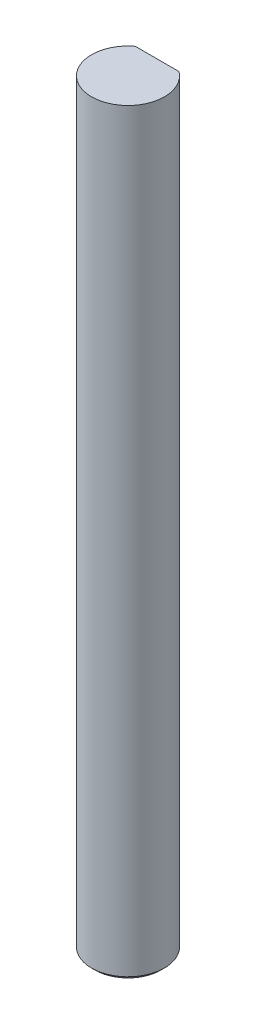
ISO-10303-21;
HEADER;
FILE_DESCRIPTION(('STEP AP214'),'2;1');
FILE_NAME('part.step','',(''),(''),'','','');
FILE_SCHEMA(('AUTOMOTIVE_DESIGN { 1 0 10303 214 1 1 1 1 }'));
ENDSEC;
DATA;
#1=APPLICATION_CONTEXT('core data for automotive mechanical design processes');
#2=APPLICATION_PROTOCOL_DEFINITION('international standard','automotive_design',2000,#1);
#3=PRODUCT_CONTEXT('',#1,'mechanical');
#4=PRODUCT('Part','Part','',(#3));
#5=PRODUCT_RELATED_PRODUCT_CATEGORY('part','',(#4));
#6=PRODUCT_DEFINITION_FORMATION('','',#4);
#7=PRODUCT_DEFINITION_CONTEXT('part definition',#1,'design');
#8=PRODUCT_DEFINITION('design','',#6,#7);
#9=PRODUCT_DEFINITION_SHAPE('','',#8);
#10=(LENGTH_UNIT() NAMED_UNIT(*) SI_UNIT(.MILLI.,.METRE.));
#11=(NAMED_UNIT(*) PLANE_ANGLE_UNIT() SI_UNIT($,.RADIAN.));
#12=(NAMED_UNIT(*) SI_UNIT($,.STERADIAN.) SOLID_ANGLE_UNIT());
#13=UNCERTAINTY_MEASURE_WITH_UNIT(LENGTH_MEASURE(1.E-05),#10,'distance_accuracy_value','');
#14=(GEOMETRIC_REPRESENTATION_CONTEXT(3) GLOBAL_UNCERTAINTY_ASSIGNED_CONTEXT((#13)) GLOBAL_UNIT_ASSIGNED_CONTEXT((#10,
#11,#12)) REPRESENTATION_CONTEXT('',''));
#15=CARTESIAN_POINT('',(0.,0.,0.));
#16=DIRECTION('',(0.,0.,1.));
#17=DIRECTION('',(1.,0.,0.));
#18=AXIS2_PLACEMENT_3D('',#15,#16,#17);
#19=CARTESIAN_POINT('',(0.,52.,0.));
#20=DIRECTION('',(0.,-1.,0.));
#21=DIRECTION('',(0.,0.,-1.));
#22=AXIS2_PLACEMENT_3D('',#19,#20,#21);
#23=CYLINDRICAL_SURFACE('',#22,2.5);
#24=CARTESIAN_POINT('',(0.,0.250000000000014,0.));
#25=DIRECTION('',(0.,1.,0.));
#26=DIRECTION('',(0.,0.,1.));
#27=AXIS2_PLACEMENT_3D('',#24,#25,#26);
#28=CIRCLE('',#27,2.5);
#29=CARTESIAN_POINT('',(0.,0.250000000000014,2.5));
#30=VERTEX_POINT('',#29);
#31=EDGE_CURVE('E50',#30,#30,#28,.T.);
#32=ORIENTED_EDGE('',*,*,#31,.T.);
#33=EDGE_LOOP('',(#32));
#34=FACE_BOUND('',#33,.T.);
#35=DIRECTION('',(0.,1.,0.));
#36=VECTOR('',#35,1.);
#37=CARTESIAN_POINT('',(1.5,37.,-2.));
#38=LINE('',#37,#36);
#39=CARTESIAN_POINT('',(1.5,37.,-2.));
#40=VERTEX_POINT('',#39);
#41=CARTESIAN_POINT('',(1.5,52.,-2.));
#42=VERTEX_POINT('',#41);
#43=EDGE_CURVE('E63',#40,#42,#38,.T.);
#44=ORIENTED_EDGE('',*,*,#43,.T.);
#45=CARTESIAN_POINT('',(0.,52.,0.));
#46=DIRECTION('',(0.,1.,0.));
#47=DIRECTION('',(0.,0.,1.));
#48=AXIS2_PLACEMENT_3D('',#45,#46,#47);
#49=CIRCLE('',#48,2.5);
#50=CARTESIAN_POINT('',(-1.5,52.,-2.));
#51=VERTEX_POINT('',#50);
#52=EDGE_CURVE('E76',#51,#42,#49,.T.);
#53=ORIENTED_EDGE('',*,*,#52,.F.);
#54=DIRECTION('',(0.,1.,0.));
#55=VECTOR('',#54,1.);
#56=CARTESIAN_POINT('',(-1.5,37.,-2.));
#57=LINE('',#56,#55);
#58=CARTESIAN_POINT('',(-1.5,37.,-2.));
#59=VERTEX_POINT('',#58);
#60=EDGE_CURVE('E57',#59,#51,#57,.T.);
#61=ORIENTED_EDGE('',*,*,#60,.F.);
#62=CARTESIAN_POINT('',(0.,37.,0.));
#63=DIRECTION('',(0.,1.,0.));
#64=DIRECTION('',(0.,0.,1.));
#65=AXIS2_PLACEMENT_3D('',#62,#63,#64);
#66=CIRCLE('',#65,2.5);
#67=EDGE_CURVE('E72',#40,#59,#66,.T.);
#68=ORIENTED_EDGE('',*,*,#67,.F.);
#69=EDGE_LOOP('',(#44,#53,#61,#68));
#70=FACE_BOUND('',#69,.T.);
#71=ADVANCED_FACE('F41',(#34,#70),#23,.T.);
#72=CARTESIAN_POINT('',(0.,52.,0.));
#73=DIRECTION('',(0.,1.,0.));
#74=DIRECTION('',(0.,0.,1.));
#75=AXIS2_PLACEMENT_3D('',#72,#73,#74);
#76=PLANE('',#75);
#77=ORIENTED_EDGE('',*,*,#52,.T.);
#78=DIRECTION('',(-1.,0.,0.));
#79=VECTOR('',#78,1.);
#80=CARTESIAN_POINT('',(0.,52.,-2.));
#81=LINE('',#80,#79);
#82=EDGE_CURVE('E67',#42,#51,#81,.T.);
#83=ORIENTED_EDGE('',*,*,#82,.T.);
#84=EDGE_LOOP('',(#77,#83));
#85=FACE_BOUND('',#84,.T.);
#86=ADVANCED_FACE('F79',(#85),#76,.T.);
#87=CARTESIAN_POINT('',(0.,0.,0.));
#88=DIRECTION('',(0.,1.,0.));
#89=DIRECTION('',(0.,0.,1.));
#90=AXIS2_PLACEMENT_3D('',#87,#88,#89);
#91=PLANE('',#90);
#92=CARTESIAN_POINT('',(0.,0.,0.));
#93=DIRECTION('',(0.,1.,0.));
#94=DIRECTION('',(0.,0.,1.));
#95=AXIS2_PLACEMENT_3D('',#92,#93,#94);
#96=CIRCLE('',#95,2.24999999999997);
#97=CARTESIAN_POINT('',(0.,0.,2.24999999999997));
#98=VERTEX_POINT('',#97);
#99=EDGE_CURVE('E11',#98,#98,#96,.F.);
#100=ORIENTED_EDGE('',*,*,#99,.T.);
#101=EDGE_LOOP('',(#100));
#102=FACE_BOUND('',#101,.T.);
#103=ADVANCED_FACE('F95',(#102),#91,.F.);
#104=CARTESIAN_POINT('',(0.,37.,-2.));
#105=DIRECTION('',(0.,0.,-1.));
#106=DIRECTION('',(-1.,0.,0.));
#107=AXIS2_PLACEMENT_3D('',#104,#105,#106);
#108=PLANE('',#107);
#109=ORIENTED_EDGE('',*,*,#82,.F.);
#110=ORIENTED_EDGE('',*,*,#43,.F.);
#111=DIRECTION('',(-1.,0.,0.));
#112=VECTOR('',#111,1.);
#113=CARTESIAN_POINT('',(0.,37.,-2.));
#114=LINE('',#113,#112);
#115=EDGE_CURVE('E83',#40,#59,#114,.T.);
#116=ORIENTED_EDGE('',*,*,#115,.T.);
#117=ORIENTED_EDGE('',*,*,#60,.T.);
#118=EDGE_LOOP('',(#109,#110,#116,#117));
#119=FACE_BOUND('',#118,.T.);
#120=ADVANCED_FACE('F68',(#119),#108,.T.);
#121=CARTESIAN_POINT('',(0.,37.,0.));
#122=DIRECTION('',(0.,1.,0.));
#123=DIRECTION('',(0.,0.,1.));
#124=AXIS2_PLACEMENT_3D('',#121,#122,#123);
#125=PLANE('',#124);
#126=ORIENTED_EDGE('',*,*,#67,.T.);
#127=ORIENTED_EDGE('',*,*,#115,.F.);
#128=EDGE_LOOP('',(#126,#127));
#129=FACE_BOUND('',#128,.T.);
#130=ADVANCED_FACE('F87',(#129),#125,.T.);
#131=CARTESIAN_POINT('',(0.,0.250000000000014,0.));
#132=DIRECTION('',(0.,1.,0.));
#133=DIRECTION('',(0.,0.,1.));
#134=AXIS2_PLACEMENT_3D('',#131,#132,#133);
#135=CONICAL_SURFACE('',#134,2.5,0.785398163397473);
#136=ORIENTED_EDGE('',*,*,#99,.F.);
#137=EDGE_LOOP('',(#136));
#138=FACE_BOUND('',#137,.T.);
#139=ORIENTED_EDGE('',*,*,#31,.F.);
#140=EDGE_LOOP('',(#139));
#141=FACE_BOUND('',#140,.T.);
#142=ADVANCED_FACE('F44',(#138,#141),#135,.T.);
#143=CLOSED_SHELL('',(#71,#86,#103,#120,#130,#142));
#144=MANIFOLD_SOLID_BREP('B2',#143);
#145=ADVANCED_BREP_SHAPE_REPRESENTATION('',(#18,#144),#14);
#146=SHAPE_DEFINITION_REPRESENTATION(#9,#145);
ENDSEC;
END-ISO-10303-21;
